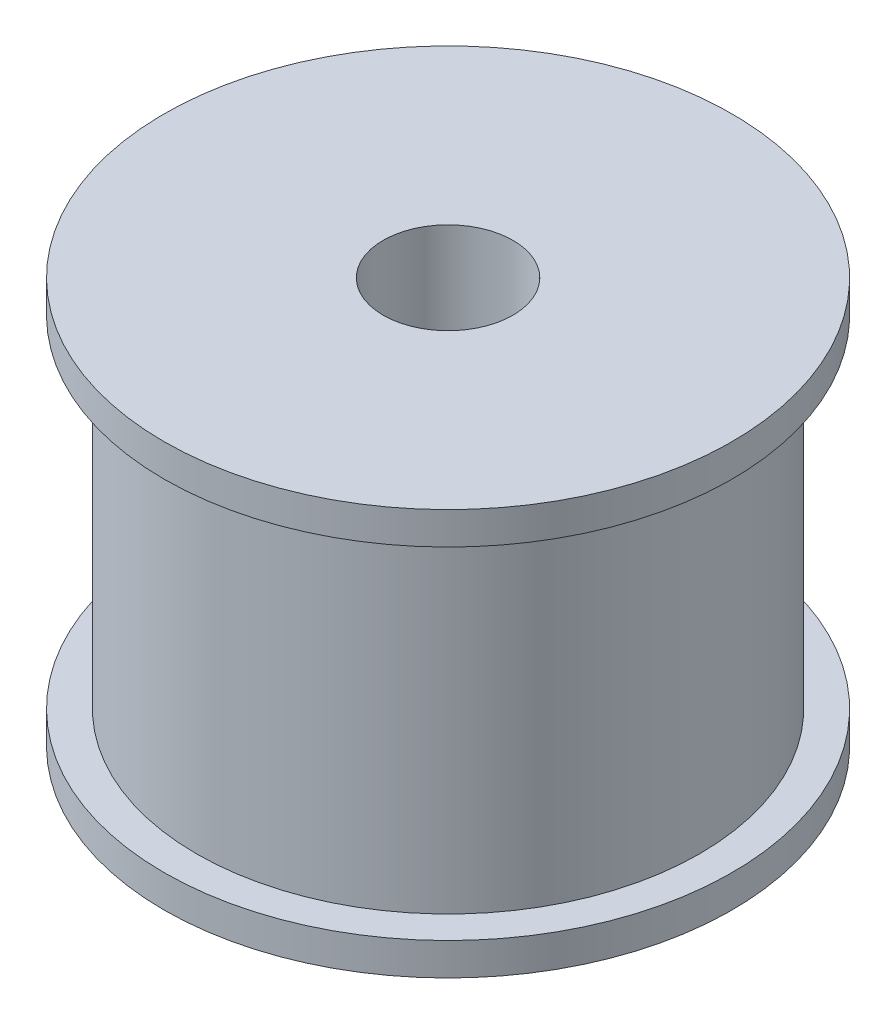
ISO-10303-21;
HEADER;
FILE_DESCRIPTION(('STEP AP214'),'2;1');
FILE_NAME('part.step','',(''),(''),'','','');
FILE_SCHEMA(('AUTOMOTIVE_DESIGN { 1 0 10303 214 1 1 1 1 }'));
ENDSEC;
DATA;
#1=APPLICATION_CONTEXT('core data for automotive mechanical design processes');
#2=APPLICATION_PROTOCOL_DEFINITION('international standard','automotive_design',2000,#1);
#3=PRODUCT_CONTEXT('',#1,'mechanical');
#4=PRODUCT('Part','Part','',(#3));
#5=PRODUCT_RELATED_PRODUCT_CATEGORY('part','',(#4));
#6=PRODUCT_DEFINITION_FORMATION('','',#4);
#7=PRODUCT_DEFINITION_CONTEXT('part definition',#1,'design');
#8=PRODUCT_DEFINITION('design','',#6,#7);
#9=PRODUCT_DEFINITION_SHAPE('','',#8);
#10=(LENGTH_UNIT() NAMED_UNIT(*) SI_UNIT(.MILLI.,.METRE.));
#11=(NAMED_UNIT(*) PLANE_ANGLE_UNIT() SI_UNIT($,.RADIAN.));
#12=(NAMED_UNIT(*) SI_UNIT($,.STERADIAN.) SOLID_ANGLE_UNIT());
#13=UNCERTAINTY_MEASURE_WITH_UNIT(LENGTH_MEASURE(1.E-05),#10,'distance_accuracy_value','');
#14=(GEOMETRIC_REPRESENTATION_CONTEXT(3) GLOBAL_UNCERTAINTY_ASSIGNED_CONTEXT((#13)) GLOBAL_UNIT_ASSIGNED_CONTEXT((#10,
#11,#12)) REPRESENTATION_CONTEXT('',''));
#15=CARTESIAN_POINT('',(0.,0.,0.));
#16=DIRECTION('',(0.,0.,1.));
#17=DIRECTION('',(1.,0.,0.));
#18=AXIS2_PLACEMENT_3D('',#15,#16,#17);
#19=CARTESIAN_POINT('',(0.,2.,0.));
#20=DIRECTION('',(0.,-1.,0.));
#21=DIRECTION('',(0.,0.,-1.));
#22=AXIS2_PLACEMENT_3D('',#19,#20,#21);
#23=CYLINDRICAL_SURFACE('',#22,17.5);
#24=CARTESIAN_POINT('',(0.,2.,0.));
#25=DIRECTION('',(0.,1.,0.));
#26=DIRECTION('',(0.,0.,1.));
#27=AXIS2_PLACEMENT_3D('',#24,#25,#26);
#28=CIRCLE('',#27,17.5);
#29=CARTESIAN_POINT('',(0.,2.,17.5));
#30=VERTEX_POINT('',#29);
#31=EDGE_CURVE('E45',#30,#30,#28,.T.);
#32=ORIENTED_EDGE('',*,*,#31,.F.);
#33=EDGE_LOOP('',(#32));
#34=FACE_BOUND('',#33,.T.);
#35=CARTESIAN_POINT('',(0.,0.,0.));
#36=DIRECTION('',(0.,1.,0.));
#37=DIRECTION('',(0.,0.,1.));
#38=AXIS2_PLACEMENT_3D('',#35,#36,#37);
#39=CIRCLE('',#38,17.5);
#40=CARTESIAN_POINT('',(0.,0.,17.5));
#41=VERTEX_POINT('',#40);
#42=EDGE_CURVE('E40',#41,#41,#39,.T.);
#43=ORIENTED_EDGE('',*,*,#42,.T.);
#44=EDGE_LOOP('',(#43));
#45=FACE_BOUND('',#44,.T.);
#46=ADVANCED_FACE('F37',(#34,#45),#23,.T.);
#47=CARTESIAN_POINT('',(0.,2.,0.));
#48=DIRECTION('',(0.,1.,0.));
#49=DIRECTION('',(0.,0.,1.));
#50=AXIS2_PLACEMENT_3D('',#47,#48,#49);
#51=PLANE('',#50);
#52=CARTESIAN_POINT('',(0.,2.,0.));
#53=DIRECTION('',(0.,1.,0.));
#54=DIRECTION('',(0.,0.,1.));
#55=AXIS2_PLACEMENT_3D('',#52,#53,#54);
#56=CIRCLE('',#55,15.5);
#57=CARTESIAN_POINT('',(0.,2.,-15.5));
#58=VERTEX_POINT('',#57);
#59=EDGE_CURVE('E10',#58,#58,#56,.T.);
#60=ORIENTED_EDGE('',*,*,#59,.F.);
#61=EDGE_LOOP('',(#60));
#62=FACE_BOUND('',#61,.T.);
#63=ORIENTED_EDGE('',*,*,#31,.T.);
#64=EDGE_LOOP('',(#63));
#65=FACE_BOUND('',#64,.T.);
#66=ADVANCED_FACE('F102',(#62,#65),#51,.T.);
#67=CARTESIAN_POINT('',(0.,0.,0.));
#68=DIRECTION('',(0.,1.,0.));
#69=DIRECTION('',(0.,0.,1.));
#70=AXIS2_PLACEMENT_3D('',#67,#68,#69);
#71=PLANE('',#70);
#72=CARTESIAN_POINT('',(0.,0.,0.));
#73=DIRECTION('',(0.,1.,0.));
#74=DIRECTION('',(0.,0.,1.));
#75=AXIS2_PLACEMENT_3D('',#72,#73,#74);
#76=CIRCLE('',#75,4.);
#77=CARTESIAN_POINT('',(0.,0.,4.));
#78=VERTEX_POINT('',#77);
#79=EDGE_CURVE('E61',#78,#78,#76,.T.);
#80=ORIENTED_EDGE('',*,*,#79,.T.);
#81=EDGE_LOOP('',(#80));
#82=FACE_BOUND('',#81,.T.);
#83=ORIENTED_EDGE('',*,*,#42,.F.);
#84=EDGE_LOOP('',(#83));
#85=FACE_BOUND('',#84,.T.);
#86=ADVANCED_FACE('F73',(#82,#85),#71,.F.);
#87=CARTESIAN_POINT('',(0.,23.,0.));
#88=DIRECTION('',(0.,-1.,0.));
#89=DIRECTION('',(0.,0.,-1.));
#90=AXIS2_PLACEMENT_3D('',#87,#88,#89);
#91=CYLINDRICAL_SURFACE('',#90,15.5);
#92=CARTESIAN_POINT('',(0.,23.,0.));
#93=DIRECTION('',(0.,1.,0.));
#94=DIRECTION('',(0.,0.,1.));
#95=AXIS2_PLACEMENT_3D('',#92,#93,#94);
#96=CIRCLE('',#95,15.5);
#97=CARTESIAN_POINT('',(0.,23.,-15.5));
#98=VERTEX_POINT('',#97);
#99=EDGE_CURVE('E52',#98,#98,#96,.T.);
#100=CARTESIAN_POINT('',(0.,23.,-15.5));
#101=CARTESIAN_POINT('',(0.,22.78125,-15.5));
#102=CARTESIAN_POINT('',(0.,22.5625,-15.5));
#103=CARTESIAN_POINT('',(0.,22.125,-15.5));
#104=CARTESIAN_POINT('',(0.,21.90625,-15.5));
#105=CARTESIAN_POINT('',(0.,21.46875,-15.5));
#106=CARTESIAN_POINT('',(0.,21.25,-15.5));
#107=CARTESIAN_POINT('',(0.,20.8125,-15.5));
#108=CARTESIAN_POINT('',(0.,20.59375,-15.5));
#109=CARTESIAN_POINT('',(0.,20.15625,-15.5));
#110=CARTESIAN_POINT('',(0.,19.9375,-15.5));
#111=CARTESIAN_POINT('',(0.,19.5,-15.5));
#112=CARTESIAN_POINT('',(0.,19.28125,-15.5));
#113=CARTESIAN_POINT('',(0.,18.84375,-15.5));
#114=CARTESIAN_POINT('',(0.,18.625,-15.5));
#115=CARTESIAN_POINT('',(0.,18.1875,-15.5));
#116=CARTESIAN_POINT('',(0.,17.96875,-15.5));
#117=CARTESIAN_POINT('',(0.,17.53125,-15.5));
#118=CARTESIAN_POINT('',(0.,17.3125,-15.5));
#119=CARTESIAN_POINT('',(0.,16.875,-15.5));
#120=CARTESIAN_POINT('',(0.,16.65625,-15.5));
#121=CARTESIAN_POINT('',(0.,16.21875,-15.5));
#122=CARTESIAN_POINT('',(0.,16.,-15.5));
#123=CARTESIAN_POINT('',(0.,15.5625,-15.5));
#124=CARTESIAN_POINT('',(0.,15.34375,-15.5));
#125=CARTESIAN_POINT('',(0.,14.90625,-15.5));
#126=CARTESIAN_POINT('',(0.,14.6875,-15.5));
#127=CARTESIAN_POINT('',(0.,14.25,-15.5));
#128=CARTESIAN_POINT('',(0.,14.03125,-15.5));
#129=CARTESIAN_POINT('',(0.,13.59375,-15.5));
#130=CARTESIAN_POINT('',(0.,13.375,-15.5));
#131=CARTESIAN_POINT('',(0.,12.9375,-15.5));
#132=CARTESIAN_POINT('',(0.,12.71875,-15.5));
#133=CARTESIAN_POINT('',(0.,12.28125,-15.5));
#134=CARTESIAN_POINT('',(0.,12.0625,-15.5));
#135=CARTESIAN_POINT('',(0.,11.625,-15.5));
#136=CARTESIAN_POINT('',(0.,11.40625,-15.5));
#137=CARTESIAN_POINT('',(0.,10.96875,-15.5));
#138=CARTESIAN_POINT('',(0.,10.75,-15.5));
#139=CARTESIAN_POINT('',(0.,10.3125,-15.5));
#140=CARTESIAN_POINT('',(0.,10.09375,-15.5));
#141=CARTESIAN_POINT('',(0.,9.65625,-15.5));
#142=CARTESIAN_POINT('',(0.,9.4375,-15.5));
#143=CARTESIAN_POINT('',(0.,9.,-15.5));
#144=CARTESIAN_POINT('',(0.,8.78125,-15.5));
#145=CARTESIAN_POINT('',(0.,8.34375,-15.5));
#146=CARTESIAN_POINT('',(0.,8.125,-15.5));
#147=CARTESIAN_POINT('',(0.,7.6875,-15.5));
#148=CARTESIAN_POINT('',(0.,7.46875,-15.5));
#149=CARTESIAN_POINT('',(0.,7.03125,-15.5));
#150=CARTESIAN_POINT('',(0.,6.8125,-15.5));
#151=CARTESIAN_POINT('',(0.,6.375,-15.5));
#152=CARTESIAN_POINT('',(0.,6.15625,-15.5));
#153=CARTESIAN_POINT('',(0.,5.71875,-15.5));
#154=CARTESIAN_POINT('',(0.,5.5,-15.5));
#155=CARTESIAN_POINT('',(0.,5.0625,-15.5));
#156=CARTESIAN_POINT('',(0.,4.84375,-15.5));
#157=CARTESIAN_POINT('',(0.,4.40625,-15.5));
#158=CARTESIAN_POINT('',(0.,4.1875,-15.5));
#159=CARTESIAN_POINT('',(0.,3.75,-15.5));
#160=CARTESIAN_POINT('',(0.,3.53125,-15.5));
#161=CARTESIAN_POINT('',(0.,3.09375,-15.5));
#162=CARTESIAN_POINT('',(0.,2.875,-15.5));
#163=CARTESIAN_POINT('',(0.,2.4375,-15.5));
#164=CARTESIAN_POINT('',(0.,2.21875,-15.5));
#165=CARTESIAN_POINT('',(0.,2.,-15.5));
#166=B_SPLINE_CURVE_WITH_KNOTS('',3,(#100,#101,#102,#103,#104,#105,#106,#107,#108,#109,#110,
#111,#112,#113,#114,#115,#116,#117,#118,#119,#120,#121,#122,#123,#124,#125,#126,#127,#128,#129,
#130,#131,#132,#133,#134,#135,#136,#137,#138,#139,#140,#141,#142,#143,#144,#145,#146,#147,#148,
#149,#150,#151,#152,#153,#154,#155,#156,#157,#158,#159,#160,#161,#162,#163,#164,#165),
.UNSPECIFIED.,.F.,.F.,(4,2,2,2,2,2,2,2,2,2,2,2,2,2,2,2,2,2,2,2,2,2,2,2,2,2,2,2,2,2,2,2,4),(0.,
0.656250000000001,1.3125,1.96875,2.625,3.28125,3.9375,4.59375,5.25,5.90625,6.5625,7.21875,7.875,
8.53125,9.1875,9.84375,10.5,11.15625,11.8125,12.46875,13.125,13.78125,14.4375,15.09375,15.75,
16.40625,17.0625,17.71875,18.375,19.03125,19.6875,20.34375,21.),.UNSPECIFIED.);
#167=EDGE_CURVE('BSEAM92',#98,#58,#166,.T.);
#168=ORIENTED_EDGE('',*,*,#99,.F.);
#169=ORIENTED_EDGE('',*,*,#59,.T.);
#170=ORIENTED_EDGE('',*,*,#167,.T.);
#171=ORIENTED_EDGE('',*,*,#167,.F.);
#172=EDGE_LOOP('',(#168,#170,#169,#171));
#173=FACE_BOUND('',#172,.T.);
#174=ADVANCED_FACE('F92',(#173),#91,.T.);
#175=CARTESIAN_POINT('',(0.,25.,0.));
#176=DIRECTION('',(0.,-1.,0.));
#177=DIRECTION('',(0.,0.,-1.));
#178=AXIS2_PLACEMENT_3D('',#175,#176,#177);
#179=CYLINDRICAL_SURFACE('',#178,17.5);
#180=CARTESIAN_POINT('',(0.,25.,0.));
#181=DIRECTION('',(0.,1.,0.));
#182=DIRECTION('',(0.,0.,1.));
#183=AXIS2_PLACEMENT_3D('',#180,#181,#182);
#184=CIRCLE('',#183,17.5);
#185=CARTESIAN_POINT('',(0.,25.,17.5));
#186=VERTEX_POINT('',#185);
#187=EDGE_CURVE('E56',#186,#186,#184,.T.);
#188=ORIENTED_EDGE('',*,*,#187,.F.);
#189=EDGE_LOOP('',(#188));
#190=FACE_BOUND('',#189,.T.);
#191=CARTESIAN_POINT('',(0.,23.,0.));
#192=DIRECTION('',(0.,1.,0.));
#193=DIRECTION('',(0.,0.,1.));
#194=AXIS2_PLACEMENT_3D('',#191,#192,#193);
#195=CIRCLE('',#194,17.5);
#196=CARTESIAN_POINT('',(0.,23.,17.5));
#197=VERTEX_POINT('',#196);
#198=EDGE_CURVE('E57',#197,#197,#195,.T.);
#199=ORIENTED_EDGE('',*,*,#198,.T.);
#200=EDGE_LOOP('',(#199));
#201=FACE_BOUND('',#200,.T.);
#202=ADVANCED_FACE('F86',(#190,#201),#179,.T.);
#203=CARTESIAN_POINT('',(0.,25.,0.));
#204=DIRECTION('',(0.,1.,0.));
#205=DIRECTION('',(0.,0.,1.));
#206=AXIS2_PLACEMENT_3D('',#203,#204,#205);
#207=PLANE('',#206);
#208=CARTESIAN_POINT('',(0.,25.,0.));
#209=DIRECTION('',(0.,1.,0.));
#210=DIRECTION('',(0.,0.,1.));
#211=AXIS2_PLACEMENT_3D('',#208,#209,#210);
#212=CIRCLE('',#211,4.);
#213=CARTESIAN_POINT('',(0.,25.,4.));
#214=VERTEX_POINT('',#213);
#215=EDGE_CURVE('E65',#214,#214,#212,.T.);
#216=ORIENTED_EDGE('',*,*,#215,.F.);
#217=EDGE_LOOP('',(#216));
#218=FACE_BOUND('',#217,.T.);
#219=ORIENTED_EDGE('',*,*,#187,.T.);
#220=EDGE_LOOP('',(#219));
#221=FACE_BOUND('',#220,.T.);
#222=ADVANCED_FACE('F83',(#218,#221),#207,.T.);
#223=CARTESIAN_POINT('',(0.,23.,0.));
#224=DIRECTION('',(0.,1.,0.));
#225=DIRECTION('',(0.,0.,1.));
#226=AXIS2_PLACEMENT_3D('',#223,#224,#225);
#227=PLANE('',#226);
#228=ORIENTED_EDGE('',*,*,#99,.T.);
#229=EDGE_LOOP('',(#228));
#230=FACE_BOUND('',#229,.T.);
#231=ORIENTED_EDGE('',*,*,#198,.F.);
#232=EDGE_LOOP('',(#231));
#233=FACE_BOUND('',#232,.T.);
#234=ADVANCED_FACE('F79',(#230,#233),#227,.F.);
#235=CARTESIAN_POINT('',(0.,0.,0.));
#236=DIRECTION('',(0.,1.,0.));
#237=DIRECTION('',(0.,0.,1.));
#238=AXIS2_PLACEMENT_3D('',#235,#236,#237);
#239=CYLINDRICAL_SURFACE('',#238,4.);
#240=ORIENTED_EDGE('',*,*,#79,.F.);
#241=EDGE_LOOP('',(#240));
#242=FACE_BOUND('',#241,.T.);
#243=ORIENTED_EDGE('',*,*,#215,.T.);
#244=EDGE_LOOP('',(#243));
#245=FACE_BOUND('',#244,.T.);
#246=ADVANCED_FACE('F76',(#242,#245),#239,.F.);
#247=CLOSED_SHELL('',(#46,#66,#86,#174,#202,#222,#234,#246));
#248=MANIFOLD_SOLID_BREP('B2',#247);
#249=ADVANCED_BREP_SHAPE_REPRESENTATION('',(#18,#248),#14);
#250=SHAPE_DEFINITION_REPRESENTATION(#9,#249);
ENDSEC;
END-ISO-10303-21;
